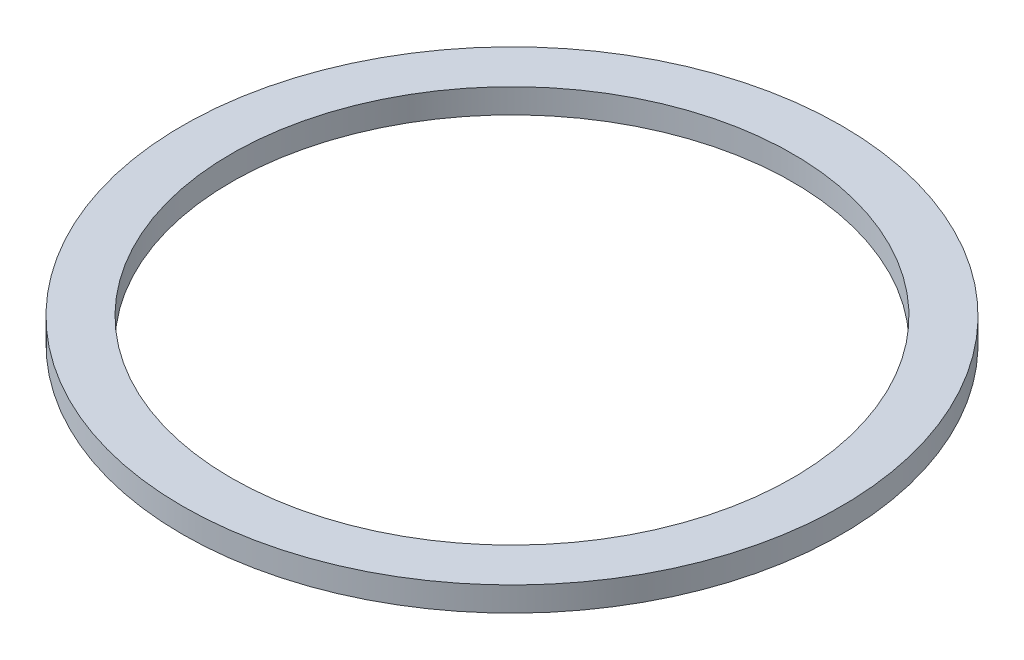
ISO-10303-21;
HEADER;
FILE_DESCRIPTION(('STEP AP214'),'2;1');
FILE_NAME('part.step','',(''),(''),'','','');
FILE_SCHEMA(('AUTOMOTIVE_DESIGN { 1 0 10303 214 1 1 1 1 }'));
ENDSEC;
DATA;
#1=APPLICATION_CONTEXT('core data for automotive mechanical design processes');
#2=APPLICATION_PROTOCOL_DEFINITION('international standard','automotive_design',2000,#1);
#3=PRODUCT_CONTEXT('',#1,'mechanical');
#4=PRODUCT('Part','Part','',(#3));
#5=PRODUCT_RELATED_PRODUCT_CATEGORY('part','',(#4));
#6=PRODUCT_DEFINITION_FORMATION('','',#4);
#7=PRODUCT_DEFINITION_CONTEXT('part definition',#1,'design');
#8=PRODUCT_DEFINITION('design','',#6,#7);
#9=PRODUCT_DEFINITION_SHAPE('','',#8);
#10=(LENGTH_UNIT() NAMED_UNIT(*) SI_UNIT(.MILLI.,.METRE.));
#11=(NAMED_UNIT(*) PLANE_ANGLE_UNIT() SI_UNIT($,.RADIAN.));
#12=(NAMED_UNIT(*) SI_UNIT($,.STERADIAN.) SOLID_ANGLE_UNIT());
#13=UNCERTAINTY_MEASURE_WITH_UNIT(LENGTH_MEASURE(1.E-05),#10,'distance_accuracy_value','');
#14=(GEOMETRIC_REPRESENTATION_CONTEXT(3) GLOBAL_UNCERTAINTY_ASSIGNED_CONTEXT((#13)) GLOBAL_UNIT_ASSIGNED_CONTEXT((#10,
#11,#12)) REPRESENTATION_CONTEXT('',''));
#15=CARTESIAN_POINT('',(0.,0.,0.));
#16=DIRECTION('',(0.,0.,1.));
#17=DIRECTION('',(1.,0.,0.));
#18=AXIS2_PLACEMENT_3D('',#15,#16,#17);
#19=CARTESIAN_POINT('',(0.,1.,0.));
#20=DIRECTION('',(0.,1.,0.));
#21=DIRECTION('',(0.,0.,1.));
#22=AXIS2_PLACEMENT_3D('',#19,#20,#21);
#23=PLANE('',#22);
#24=CARTESIAN_POINT('',(0.,1.,0.));
#25=DIRECTION('',(0.,1.,0.));
#26=DIRECTION('',(0.,0.,1.));
#27=AXIS2_PLACEMENT_3D('',#24,#25,#26);
#28=CIRCLE('',#27,13.5);
#29=CARTESIAN_POINT('',(0.,1.,13.5));
#30=VERTEX_POINT('',#29);
#31=EDGE_CURVE('E10',#30,#30,#28,.T.);
#32=ORIENTED_EDGE('',*,*,#31,.T.);
#33=EDGE_LOOP('',(#32));
#34=FACE_BOUND('',#33,.T.);
#35=CARTESIAN_POINT('',(0.,1.,0.));
#36=DIRECTION('',(0.,1.,0.));
#37=DIRECTION('',(0.,0.,1.));
#38=AXIS2_PLACEMENT_3D('',#35,#36,#37);
#39=CIRCLE('',#38,11.5);
#40=CARTESIAN_POINT('',(0.,1.,11.5));
#41=VERTEX_POINT('',#40);
#42=EDGE_CURVE('E42',#41,#41,#39,.T.);
#43=ORIENTED_EDGE('',*,*,#42,.F.);
#44=EDGE_LOOP('',(#43));
#45=FACE_BOUND('',#44,.T.);
#46=ADVANCED_FACE('F31',(#34,#45),#23,.T.);
#47=CARTESIAN_POINT('',(0.,0.,0.));
#48=DIRECTION('',(0.,1.,0.));
#49=DIRECTION('',(0.,0.,1.));
#50=AXIS2_PLACEMENT_3D('',#47,#48,#49);
#51=PLANE('',#50);
#52=CARTESIAN_POINT('',(0.,0.,0.));
#53=DIRECTION('',(0.,1.,0.));
#54=DIRECTION('',(0.,0.,1.));
#55=AXIS2_PLACEMENT_3D('',#52,#53,#54);
#56=CIRCLE('',#55,13.5);
#57=CARTESIAN_POINT('',(0.,0.,13.5));
#58=VERTEX_POINT('',#57);
#59=EDGE_CURVE('E35',#58,#58,#56,.T.);
#60=ORIENTED_EDGE('',*,*,#59,.F.);
#61=EDGE_LOOP('',(#60));
#62=FACE_BOUND('',#61,.T.);
#63=CARTESIAN_POINT('',(0.,0.,0.));
#64=DIRECTION('',(0.,1.,0.));
#65=DIRECTION('',(0.,0.,1.));
#66=AXIS2_PLACEMENT_3D('',#63,#64,#65);
#67=CIRCLE('',#66,11.5);
#68=CARTESIAN_POINT('',(0.,0.,11.5));
#69=VERTEX_POINT('',#68);
#70=EDGE_CURVE('E44',#69,#69,#67,.T.);
#71=ORIENTED_EDGE('',*,*,#70,.T.);
#72=EDGE_LOOP('',(#71));
#73=FACE_BOUND('',#72,.T.);
#74=ADVANCED_FACE('F54',(#62,#73),#51,.F.);
#75=CARTESIAN_POINT('',(0.,1.,0.));
#76=DIRECTION('',(0.,-1.,0.));
#77=DIRECTION('',(0.,0.,-1.));
#78=AXIS2_PLACEMENT_3D('',#75,#76,#77);
#79=CYLINDRICAL_SURFACE('',#78,13.5);
#80=ORIENTED_EDGE('',*,*,#31,.F.);
#81=EDGE_LOOP('',(#80));
#82=FACE_BOUND('',#81,.T.);
#83=ORIENTED_EDGE('',*,*,#59,.T.);
#84=EDGE_LOOP('',(#83));
#85=FACE_BOUND('',#84,.T.);
#86=ADVANCED_FACE('F33',(#82,#85),#79,.T.);
#87=CARTESIAN_POINT('',(0.,1.,0.));
#88=DIRECTION('',(0.,-1.,0.));
#89=DIRECTION('',(0.,0.,-1.));
#90=AXIS2_PLACEMENT_3D('',#87,#88,#89);
#91=CYLINDRICAL_SURFACE('',#90,11.5);
#92=ORIENTED_EDGE('',*,*,#42,.T.);
#93=EDGE_LOOP('',(#92));
#94=FACE_BOUND('',#93,.T.);
#95=ORIENTED_EDGE('',*,*,#70,.F.);
#96=EDGE_LOOP('',(#95));
#97=FACE_BOUND('',#96,.T.);
#98=ADVANCED_FACE('F50',(#94,#97),#91,.F.);
#99=CLOSED_SHELL('',(#46,#74,#86,#98));
#100=MANIFOLD_SOLID_BREP('B2',#99);
#101=ADVANCED_BREP_SHAPE_REPRESENTATION('',(#18,#100),#14);
#102=SHAPE_DEFINITION_REPRESENTATION(#9,#101);
ENDSEC;
END-ISO-10303-21;
